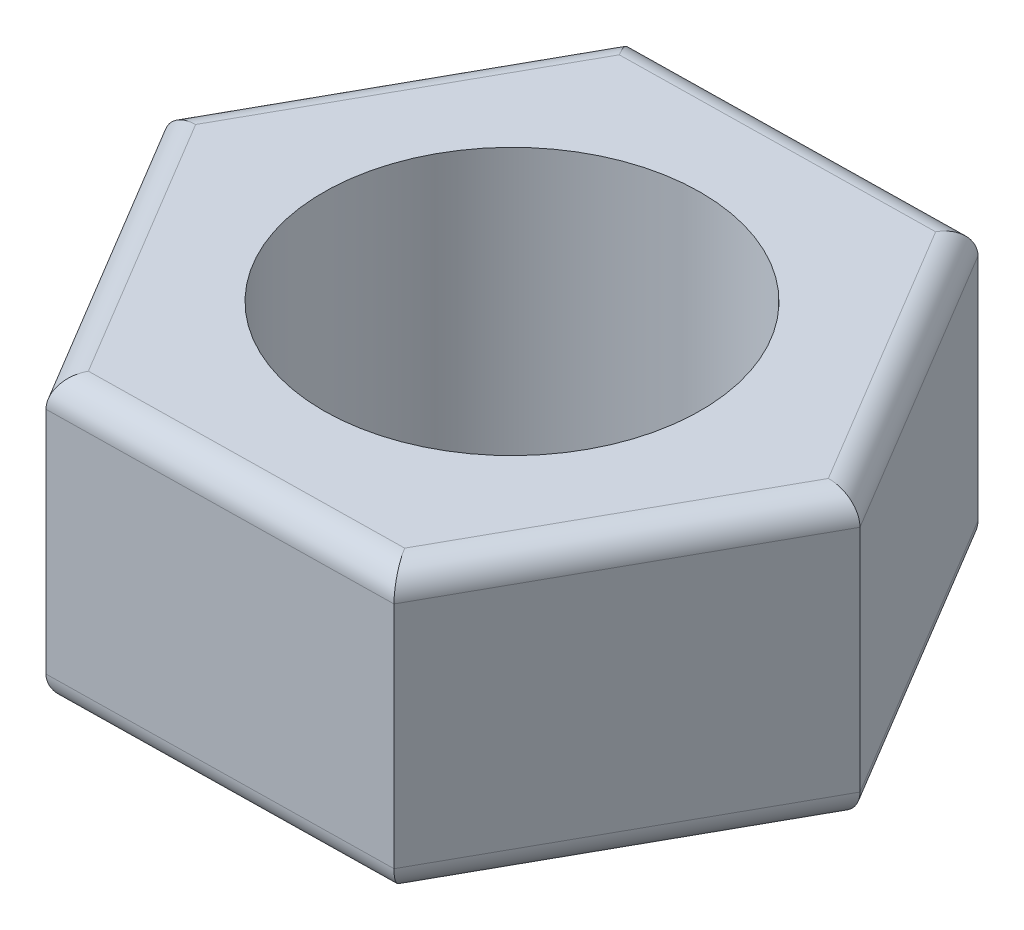
ISO-10303-21;
HEADER;
FILE_DESCRIPTION(('STEP AP214'),'2;1');
FILE_NAME('part.step','',(''),(''),'','','');
FILE_SCHEMA(('AUTOMOTIVE_DESIGN { 1 0 10303 214 1 1 1 1 }'));
ENDSEC;
DATA;
#1=APPLICATION_CONTEXT('core data for automotive mechanical design processes');
#2=APPLICATION_PROTOCOL_DEFINITION('international standard','automotive_design',2000,#1);
#3=PRODUCT_CONTEXT('',#1,'mechanical');
#4=PRODUCT('Part','Part','',(#3));
#5=PRODUCT_RELATED_PRODUCT_CATEGORY('part','',(#4));
#6=PRODUCT_DEFINITION_FORMATION('','',#4);
#7=PRODUCT_DEFINITION_CONTEXT('part definition',#1,'design');
#8=PRODUCT_DEFINITION('design','',#6,#7);
#9=PRODUCT_DEFINITION_SHAPE('','',#8);
#10=(LENGTH_UNIT() NAMED_UNIT(*) SI_UNIT(.MILLI.,.METRE.));
#11=(NAMED_UNIT(*) PLANE_ANGLE_UNIT() SI_UNIT($,.RADIAN.));
#12=(NAMED_UNIT(*) SI_UNIT($,.STERADIAN.) SOLID_ANGLE_UNIT());
#13=UNCERTAINTY_MEASURE_WITH_UNIT(LENGTH_MEASURE(1.E-05),#10,'distance_accuracy_value','');
#14=(GEOMETRIC_REPRESENTATION_CONTEXT(3) GLOBAL_UNCERTAINTY_ASSIGNED_CONTEXT((#13)) GLOBAL_UNIT_ASSIGNED_CONTEXT((#10,
#11,#12)) REPRESENTATION_CONTEXT('',''));
#15=CARTESIAN_POINT('',(0.,0.,0.));
#16=DIRECTION('',(0.,0.,1.));
#17=DIRECTION('',(1.,0.,0.));
#18=AXIS2_PLACEMENT_3D('',#15,#16,#17);
#19=CARTESIAN_POINT('',(6.52368362497381,10.5,10.8983891146619));
#20=DIRECTION('',(0.,1.,0.));
#21=DIRECTION('',(0.,0.,1.));
#22=AXIS2_PLACEMENT_3D('',#19,#20,#21);
#23=PLANE('',#22);
#24=DIRECTION('',(-0.486268542114229,0.,0.873809421412989));
#25=VECTOR('',#24,1.);
#26=CARTESIAN_POINT('',(-11.826314224699,10.5,0.686749730263134));
#27=LINE('',#26,#25);
#28=CARTESIAN_POINT('',(-5.93062147724893,10.5,-9.90762646787449));
#29=VERTEX_POINT('',#28);
#30=CARTESIAN_POINT('',(-11.5455669510109,10.5,0.182255625589913));
#31=VERTEX_POINT('',#30);
#32=EDGE_CURVE('E41',#29,#31,#27,.T.);
#33=ORIENTED_EDGE('',*,*,#32,.T.);
#34=DIRECTION('',(0.513606885952716,0.,0.85802562123864));
#35=VECTOR('',#34,1.);
#36=CARTESIAN_POINT('',(-5.3184143998995,10.5,10.5852634168581));
#37=LINE('',#36,#35);
#38=CARTESIAN_POINT('',(-5.61494547376195,10.5,10.0898820934644));
#39=VERTEX_POINT('',#38);
#40=EDGE_CURVE('E11',#31,#39,#37,.T.);
#41=ORIENTED_EDGE('',*,*,#40,.T.);
#42=DIRECTION('',(0.999875428066945,0.,-0.0157838001743496));
#43=VECTOR('',#42,1.);
#44=CARTESIAN_POINT('',(6.50789982479946,10.5,9.89851368659498));
#45=LINE('',#44,#43);
#46=CARTESIAN_POINT('',(5.93062147724892,10.5,9.90762646787448));
#47=VERTEX_POINT('',#46);
#48=EDGE_CURVE('E157',#39,#47,#45,.T.);
#49=ORIENTED_EDGE('',*,*,#48,.T.);
#50=DIRECTION('',(0.486268542114229,0.,-0.873809421412989));
#51=VECTOR('',#50,1.);
#52=CARTESIAN_POINT('',(11.826314224699,10.5,-0.686749730263147));
#53=LINE('',#52,#51);
#54=CARTESIAN_POINT('',(11.5455669510109,10.5,-0.182255625589923));
#55=VERTEX_POINT('',#54);
#56=EDGE_CURVE('E254',#47,#55,#53,.T.);
#57=ORIENTED_EDGE('',*,*,#56,.T.);
#58=DIRECTION('',(-0.513606885952716,0.,-0.85802562123864));
#59=VECTOR('',#58,1.);
#60=CARTESIAN_POINT('',(5.31841439989949,10.5,-10.5852634168581));
#61=LINE('',#60,#59);
#62=CARTESIAN_POINT('',(5.61494547376194,10.5,-10.0898820934644));
#63=VERTEX_POINT('',#62);
#64=EDGE_CURVE('E256',#55,#63,#61,.T.);
#65=ORIENTED_EDGE('',*,*,#64,.T.);
#66=DIRECTION('',(-0.999875428066945,0.,0.0157838001743493));
#67=VECTOR('',#66,1.);
#68=CARTESIAN_POINT('',(-6.50789982479947,10.5,-9.89851368659499));
#69=LINE('',#68,#67);
#70=EDGE_CURVE('E52',#63,#29,#69,.T.);
#71=ORIENTED_EDGE('',*,*,#70,.T.);
#72=EDGE_LOOP('',(#33,#41,#49,#57,#65,#71));
#73=FACE_BOUND('',#72,.T.);
#74=CARTESIAN_POINT('',(0.,10.5,0.));
#75=DIRECTION('',(0.,1.,0.));
#76=DIRECTION('',(0.,0.,1.));
#77=AXIS2_PLACEMENT_3D('',#74,#75,#76);
#78=CIRCLE('',#77,7.);
#79=CARTESIAN_POINT('',(0.,10.5,-7.));
#80=VERTEX_POINT('',#79);
#81=EDGE_CURVE('E146',#80,#80,#78,.T.);
#82=ORIENTED_EDGE('',*,*,#81,.F.);
#83=EDGE_LOOP('',(#82));
#84=FACE_BOUND('',#83,.T.);
#85=ADVANCED_FACE('F32',(#73,#84),#23,.T.);
#86=CARTESIAN_POINT('',(6.52368362497381,0.,10.8983891146619));
#87=DIRECTION('',(0.,1.,0.));
#88=DIRECTION('',(0.,0.,1.));
#89=AXIS2_PLACEMENT_3D('',#86,#87,#88);
#90=PLANE('',#89);
#91=DIRECTION('',(0.999875428066945,0.,-0.0157838001743496));
#92=VECTOR('',#91,1.);
#93=CARTESIAN_POINT('',(6.50789982479946,0.,9.89851368659498));
#94=LINE('',#93,#92);
#95=CARTESIAN_POINT('',(5.93062147724892,0.,9.90762646787448));
#96=VERTEX_POINT('',#95);
#97=CARTESIAN_POINT('',(-5.61494547376195,0.,10.0898820934644));
#98=VERTEX_POINT('',#97);
#99=EDGE_CURVE('E224',#96,#98,#94,.F.);
#100=ORIENTED_EDGE('',*,*,#99,.T.);
#101=DIRECTION('',(0.513606885952716,0.,0.85802562123864));
#102=VECTOR('',#101,1.);
#103=CARTESIAN_POINT('',(-2.0565725874126,0.,16.0344579741891));
#104=LINE('',#103,#102);
#105=CARTESIAN_POINT('',(-11.5455669510109,0.,0.182255625589914));
#106=VERTEX_POINT('',#105);
#107=EDGE_CURVE('E234',#98,#106,#104,.F.);
#108=ORIENTED_EDGE('',*,*,#107,.T.);
#109=DIRECTION('',(-0.486268542114229,0.,0.873809421412989));
#110=VECTOR('',#109,1.);
#111=CARTESIAN_POINT('',(-11.826314224699,0.,0.686749730263125));
#112=LINE('',#111,#110);
#113=CARTESIAN_POINT('',(-5.93062147724893,0.,-9.90762646787449));
#114=VERTEX_POINT('',#113);
#115=EDGE_CURVE('E232',#106,#114,#112,.F.);
#116=ORIENTED_EDGE('',*,*,#115,.T.);
#117=DIRECTION('',(-0.999875428066945,0.,0.0157838001743493));
#118=VECTOR('',#117,1.);
#119=CARTESIAN_POINT('',(6.19222382131248,0.,-10.0989948747439));
#120=LINE('',#119,#118);
#121=CARTESIAN_POINT('',(5.61494547376194,0.,-10.0898820934644));
#122=VERTEX_POINT('',#121);
#123=EDGE_CURVE('E230',#114,#122,#120,.F.);
#124=ORIENTED_EDGE('',*,*,#123,.T.);
#125=DIRECTION('',(-0.513606885952716,0.,-0.85802562123864));
#126=VECTOR('',#125,1.);
#127=CARTESIAN_POINT('',(15.1039398373602,0.,5.76232025513477));
#128=LINE('',#127,#126);
#129=CARTESIAN_POINT('',(11.5455669510109,0.,-0.182255625589924));
#130=VERTEX_POINT('',#129);
#131=EDGE_CURVE('E228',#122,#130,#128,.F.);
#132=ORIENTED_EDGE('',*,*,#131,.T.);
#133=DIRECTION('',(0.486268542114229,0.,-0.873809421412989));
#134=VECTOR('',#133,1.);
#135=CARTESIAN_POINT('',(5.64987420356082,0.,10.4121205725477));
#136=LINE('',#135,#134);
#137=EDGE_CURVE('E226',#130,#96,#136,.F.);
#138=ORIENTED_EDGE('',*,*,#137,.T.);
#139=EDGE_LOOP('',(#100,#108,#116,#124,#132,#138));
#140=FACE_BOUND('',#139,.T.);
#141=CARTESIAN_POINT('',(0.,0.,0.));
#142=DIRECTION('',(0.,1.,0.));
#143=DIRECTION('',(0.,0.,1.));
#144=AXIS2_PLACEMENT_3D('',#141,#142,#143);
#145=CIRCLE('',#144,7.);
#146=CARTESIAN_POINT('',(0.,0.,-7.));
#147=VERTEX_POINT('',#146);
#148=EDGE_CURVE('E200',#147,#147,#145,.T.);
#149=ORIENTED_EDGE('',*,*,#148,.T.);
#150=EDGE_LOOP('',(#149));
#151=FACE_BOUND('',#150,.T.);
#152=ADVANCED_FACE('F300',(#140,#151),#90,.F.);
#153=CARTESIAN_POINT('',(-6.17644002113814,10.5,11.0988703028108));
#154=DIRECTION('',(-0.0157838001743496,0.,-0.999875428066945));
#155=DIRECTION('',(-0.999875428066945,0.,0.0157838001743496));
#156=AXIS2_PLACEMENT_3D('',#153,#154,#155);
#157=PLANE('',#156);
#158=DIRECTION('',(0.,-1.,0.));
#159=VECTOR('',#158,1.);
#160=CARTESIAN_POINT('',(-6.17644002113814,10.5,11.0988703028108));
#161=LINE('',#160,#159);
#162=CARTESIAN_POINT('',(-6.17644002113814,9.5,11.0988703028108));
#163=VERTEX_POINT('',#162);
#164=CARTESIAN_POINT('',(-6.17644002113814,1.,11.0988703028108));
#165=VERTEX_POINT('',#164);
#166=EDGE_CURVE('E125',#163,#165,#161,.T.);
#167=ORIENTED_EDGE('',*,*,#166,.T.);
#168=DIRECTION('',(0.999875428066945,0.,-0.0157838001743496));
#169=VECTOR('',#168,1.);
#170=CARTESIAN_POINT('',(-6.17644002113814,0.999999999999999,11.0988703028108));
#171=LINE('',#170,#169);
#172=CARTESIAN_POINT('',(6.52368362497381,1.,10.8983891146619));
#173=VERTEX_POINT('',#172);
#174=EDGE_CURVE('E132',#165,#173,#171,.T.);
#175=ORIENTED_EDGE('',*,*,#174,.T.);
#176=DIRECTION('',(0.,-1.,0.));
#177=VECTOR('',#176,1.);
#178=CARTESIAN_POINT('',(6.52368362497381,10.5,10.8983891146619));
#179=LINE('',#178,#177);
#180=CARTESIAN_POINT('',(6.52368362497381,9.5,10.8983891146619));
#181=VERTEX_POINT('',#180);
#182=EDGE_CURVE('E127',#181,#173,#179,.T.);
#183=ORIENTED_EDGE('',*,*,#182,.F.);
#184=DIRECTION('',(0.999875428066945,0.,-0.0157838001743496));
#185=VECTOR('',#184,1.);
#186=CARTESIAN_POINT('',(-6.17644002113815,9.5,11.0988703028108));
#187=LINE('',#186,#185);
#188=EDGE_CURVE('E122',#181,#163,#187,.F.);
#189=ORIENTED_EDGE('',*,*,#188,.T.);
#190=EDGE_LOOP('',(#167,#175,#183,#189));
#191=FACE_BOUND('',#190,.T.);
#192=ADVANCED_FACE('F124',(#191),#157,.F.);
#193=CARTESIAN_POINT('',(6.52368362497381,10.5,10.8983891146619));
#194=DIRECTION('',(-0.873809421412989,0.,-0.486268542114229));
#195=DIRECTION('',(-0.486268542114229,0.,0.873809421412989));
#196=AXIS2_PLACEMENT_3D('',#193,#194,#195);
#197=PLANE('',#196);
#198=ORIENTED_EDGE('',*,*,#182,.T.);
#199=DIRECTION('',(0.486268542114229,0.,-0.873809421412989));
#200=VECTOR('',#199,1.);
#201=CARTESIAN_POINT('',(6.52368362497381,0.999999999999999,10.8983891146619));
#202=LINE('',#201,#200);
#203=CARTESIAN_POINT('',(12.7001236461119,1.,-0.200481188148916));
#204=VERTEX_POINT('',#203);
#205=EDGE_CURVE('E133',#173,#204,#202,.T.);
#206=ORIENTED_EDGE('',*,*,#205,.T.);
#207=DIRECTION('',(0.,-1.,0.));
#208=VECTOR('',#207,1.);
#209=CARTESIAN_POINT('',(12.7001236461119,10.5,-0.200481188148916));
#210=LINE('',#209,#208);
#211=CARTESIAN_POINT('',(12.7001236461119,9.5,-0.200481188148916));
#212=VERTEX_POINT('',#211);
#213=EDGE_CURVE('E219',#212,#204,#210,.T.);
#214=ORIENTED_EDGE('',*,*,#213,.F.);
#215=DIRECTION('',(0.486268542114229,0.,-0.873809421412989));
#216=VECTOR('',#215,1.);
#217=CARTESIAN_POINT('',(6.52368362497381,9.5,10.8983891146619));
#218=LINE('',#217,#216);
#219=EDGE_CURVE('E249',#212,#181,#218,.F.);
#220=ORIENTED_EDGE('',*,*,#219,.T.);
#221=EDGE_LOOP('',(#198,#206,#214,#220));
#222=FACE_BOUND('',#221,.T.);
#223=ADVANCED_FACE('F268',(#222),#197,.F.);
#224=CARTESIAN_POINT('',(12.7001236461119,10.5,-0.200481188148916));
#225=DIRECTION('',(-0.85802562123864,0.,0.513606885952716));
#226=DIRECTION('',(0.513606885952716,0.,0.85802562123864));
#227=AXIS2_PLACEMENT_3D('',#224,#225,#226);
#228=PLANE('',#227);
#229=ORIENTED_EDGE('',*,*,#213,.T.);
#230=DIRECTION('',(-0.513606885952716,0.,-0.85802562123864));
#231=VECTOR('',#230,1.);
#232=CARTESIAN_POINT('',(12.7001236461119,0.999999999999999,-0.200481188148916));
#233=LINE('',#232,#231);
#234=CARTESIAN_POINT('',(6.17644002113813,1.,-11.0988703028108));
#235=VERTEX_POINT('',#234);
#236=EDGE_CURVE('E247',#204,#235,#233,.T.);
#237=ORIENTED_EDGE('',*,*,#236,.T.);
#238=DIRECTION('',(0.,-1.,0.));
#239=VECTOR('',#238,1.);
#240=CARTESIAN_POINT('',(6.17644002113813,10.5,-11.0988703028108));
#241=LINE('',#240,#239);
#242=CARTESIAN_POINT('',(6.17644002113813,9.5,-11.0988703028108));
#243=VERTEX_POINT('',#242);
#244=EDGE_CURVE('E216',#243,#235,#241,.T.);
#245=ORIENTED_EDGE('',*,*,#244,.F.);
#246=DIRECTION('',(-0.513606885952716,0.,-0.85802562123864));
#247=VECTOR('',#246,1.);
#248=CARTESIAN_POINT('',(12.7001236461119,9.5,-0.200481188148916));
#249=LINE('',#248,#247);
#250=EDGE_CURVE('E245',#243,#212,#249,.F.);
#251=ORIENTED_EDGE('',*,*,#250,.T.);
#252=EDGE_LOOP('',(#229,#237,#245,#251));
#253=FACE_BOUND('',#252,.T.);
#254=ADVANCED_FACE('F271',(#253),#228,.F.);
#255=CARTESIAN_POINT('',(6.17644002113813,10.5,-11.0988703028108));
#256=DIRECTION('',(0.0157838001743493,0.,0.999875428066945));
#257=DIRECTION('',(0.999875428066945,0.,-0.0157838001743493));
#258=AXIS2_PLACEMENT_3D('',#255,#256,#257);
#259=PLANE('',#258);
#260=ORIENTED_EDGE('',*,*,#244,.T.);
#261=DIRECTION('',(-0.999875428066945,0.,0.0157838001743493));
#262=VECTOR('',#261,1.);
#263=CARTESIAN_POINT('',(6.17644002113813,0.999999999999999,-11.0988703028108));
#264=LINE('',#263,#262);
#265=CARTESIAN_POINT('',(-6.52368362497382,1.,-10.8983891146619));
#266=VERTEX_POINT('',#265);
#267=EDGE_CURVE('E243',#235,#266,#264,.T.);
#268=ORIENTED_EDGE('',*,*,#267,.T.);
#269=DIRECTION('',(0.,-1.,0.));
#270=VECTOR('',#269,1.);
#271=CARTESIAN_POINT('',(-6.52368362497382,10.5,-10.8983891146619));
#272=LINE('',#271,#270);
#273=CARTESIAN_POINT('',(-6.52368362497382,9.5,-10.8983891146619));
#274=VERTEX_POINT('',#273);
#275=EDGE_CURVE('E213',#274,#266,#272,.T.);
#276=ORIENTED_EDGE('',*,*,#275,.F.);
#277=DIRECTION('',(-0.999875428066945,0.,0.0157838001743493));
#278=VECTOR('',#277,1.);
#279=CARTESIAN_POINT('',(6.17644002113813,9.5,-11.0988703028108));
#280=LINE('',#279,#278);
#281=EDGE_CURVE('E241',#274,#243,#280,.F.);
#282=ORIENTED_EDGE('',*,*,#281,.T.);
#283=EDGE_LOOP('',(#260,#268,#276,#282));
#284=FACE_BOUND('',#283,.T.);
#285=ADVANCED_FACE('F281',(#284),#259,.F.);
#286=CARTESIAN_POINT('',(-6.52368362497382,10.5,-10.8983891146619));
#287=DIRECTION('',(0.873809421412989,0.,0.486268542114229));
#288=DIRECTION('',(0.486268542114229,0.,-0.873809421412989));
#289=AXIS2_PLACEMENT_3D('',#286,#287,#288);
#290=PLANE('',#289);
#291=ORIENTED_EDGE('',*,*,#275,.T.);
#292=DIRECTION('',(-0.486268542114229,0.,0.873809421412989));
#293=VECTOR('',#292,1.);
#294=CARTESIAN_POINT('',(-6.52368362497382,0.999999999999999,-10.8983891146619));
#295=LINE('',#294,#293);
#296=CARTESIAN_POINT('',(-12.7001236461119,1.,0.200481188148907));
#297=VERTEX_POINT('',#296);
#298=EDGE_CURVE('E239',#266,#297,#295,.T.);
#299=ORIENTED_EDGE('',*,*,#298,.T.);
#300=DIRECTION('',(0.,-1.,0.));
#301=VECTOR('',#300,1.);
#302=CARTESIAN_POINT('',(-12.7001236461119,10.5,0.200481188148907));
#303=LINE('',#302,#301);
#304=CARTESIAN_POINT('',(-12.7001236461119,9.5,0.200481188148907));
#305=VERTEX_POINT('',#304);
#306=EDGE_CURVE('E145',#305,#297,#303,.T.);
#307=ORIENTED_EDGE('',*,*,#306,.F.);
#308=DIRECTION('',(-0.486268542114229,0.,0.873809421412989));
#309=VECTOR('',#308,1.);
#310=CARTESIAN_POINT('',(-6.52368362497382,9.5,-10.8983891146619));
#311=LINE('',#310,#309);
#312=EDGE_CURVE('E237',#305,#274,#311,.F.);
#313=ORIENTED_EDGE('',*,*,#312,.T.);
#314=EDGE_LOOP('',(#291,#299,#307,#313));
#315=FACE_BOUND('',#314,.T.);
#316=ADVANCED_FACE('F283',(#315),#290,.F.);
#317=CARTESIAN_POINT('',(-12.7001236461119,10.5,0.200481188148907));
#318=DIRECTION('',(0.85802562123864,0.,-0.513606885952716));
#319=DIRECTION('',(-0.513606885952716,0.,-0.85802562123864));
#320=AXIS2_PLACEMENT_3D('',#317,#318,#319);
#321=PLANE('',#320);
#322=ORIENTED_EDGE('',*,*,#306,.T.);
#323=DIRECTION('',(0.513606885952716,0.,0.85802562123864));
#324=VECTOR('',#323,1.);
#325=CARTESIAN_POINT('',(-12.7001236461119,0.999999999999999,0.200481188148907));
#326=LINE('',#325,#324);
#327=EDGE_CURVE('E144',#297,#165,#326,.T.);
#328=ORIENTED_EDGE('',*,*,#327,.T.);
#329=ORIENTED_EDGE('',*,*,#166,.F.);
#330=DIRECTION('',(0.513606885952716,0.,0.85802562123864));
#331=VECTOR('',#330,1.);
#332=CARTESIAN_POINT('',(-12.7001236461119,9.5,0.200481188148907));
#333=LINE('',#332,#331);
#334=EDGE_CURVE('E141',#163,#305,#333,.F.);
#335=ORIENTED_EDGE('',*,*,#334,.T.);
#336=EDGE_LOOP('',(#322,#328,#329,#335));
#337=FACE_BOUND('',#336,.T.);
#338=ADVANCED_FACE('F140',(#337),#321,.F.);
#339=CARTESIAN_POINT('',(0.,10.5,0.));
#340=DIRECTION('',(0.,-1.,0.));
#341=DIRECTION('',(0.,0.,-1.));
#342=AXIS2_PLACEMENT_3D('',#339,#340,#341);
#343=CYLINDRICAL_SURFACE('',#342,7.);
#344=CARTESIAN_POINT('',(0.,10.5,-7.));
#345=CARTESIAN_POINT('',(0.,10.390625,-7.));
#346=CARTESIAN_POINT('',(0.,10.28125,-7.));
#347=CARTESIAN_POINT('',(0.,10.0625,-7.));
#348=CARTESIAN_POINT('',(0.,9.953125,-7.));
#349=CARTESIAN_POINT('',(0.,9.734375,-7.));
#350=CARTESIAN_POINT('',(0.,9.625,-7.));
#351=CARTESIAN_POINT('',(0.,9.40625,-7.));
#352=CARTESIAN_POINT('',(0.,9.296875,-7.));
#353=CARTESIAN_POINT('',(0.,9.078125,-7.));
#354=CARTESIAN_POINT('',(0.,8.96875,-7.));
#355=CARTESIAN_POINT('',(0.,8.75,-7.));
#356=CARTESIAN_POINT('',(0.,8.640625,-7.));
#357=CARTESIAN_POINT('',(0.,8.421875,-7.));
#358=CARTESIAN_POINT('',(0.,8.3125,-7.));
#359=CARTESIAN_POINT('',(0.,8.09375,-7.));
#360=CARTESIAN_POINT('',(0.,7.984375,-7.));
#361=CARTESIAN_POINT('',(0.,7.765625,-7.));
#362=CARTESIAN_POINT('',(0.,7.65625,-7.));
#363=CARTESIAN_POINT('',(0.,7.4375,-7.));
#364=CARTESIAN_POINT('',(0.,7.328125,-7.));
#365=CARTESIAN_POINT('',(0.,7.109375,-7.));
#366=CARTESIAN_POINT('',(0.,7.,-7.));
#367=CARTESIAN_POINT('',(0.,6.78125,-7.));
#368=CARTESIAN_POINT('',(0.,6.671875,-7.));
#369=CARTESIAN_POINT('',(0.,6.453125,-7.));
#370=CARTESIAN_POINT('',(0.,6.34375,-7.));
#371=CARTESIAN_POINT('',(0.,6.125,-7.));
#372=CARTESIAN_POINT('',(0.,6.015625,-7.));
#373=CARTESIAN_POINT('',(0.,5.796875,-7.));
#374=CARTESIAN_POINT('',(0.,5.6875,-7.));
#375=CARTESIAN_POINT('',(0.,5.46875,-7.));
#376=CARTESIAN_POINT('',(0.,5.359375,-7.));
#377=CARTESIAN_POINT('',(0.,5.140625,-7.));
#378=CARTESIAN_POINT('',(0.,5.03125,-7.));
#379=CARTESIAN_POINT('',(0.,4.8125,-7.));
#380=CARTESIAN_POINT('',(0.,4.703125,-7.));
#381=CARTESIAN_POINT('',(0.,4.484375,-7.));
#382=CARTESIAN_POINT('',(0.,4.375,-7.));
#383=CARTESIAN_POINT('',(0.,4.15625,-7.));
#384=CARTESIAN_POINT('',(0.,4.046875,-7.));
#385=CARTESIAN_POINT('',(0.,3.828125,-7.));
#386=CARTESIAN_POINT('',(0.,3.71875,-7.));
#387=CARTESIAN_POINT('',(0.,3.5,-7.));
#388=CARTESIAN_POINT('',(0.,3.390625,-7.));
#389=CARTESIAN_POINT('',(0.,3.171875,-7.));
#390=CARTESIAN_POINT('',(0.,3.0625,-7.));
#391=CARTESIAN_POINT('',(0.,2.84375,-7.));
#392=CARTESIAN_POINT('',(0.,2.734375,-7.));
#393=CARTESIAN_POINT('',(0.,2.515625,-7.));
#394=CARTESIAN_POINT('',(0.,2.40625,-7.));
#395=CARTESIAN_POINT('',(0.,2.1875,-7.));
#396=CARTESIAN_POINT('',(0.,2.078125,-7.));
#397=CARTESIAN_POINT('',(0.,1.859375,-7.));
#398=CARTESIAN_POINT('',(0.,1.75,-7.));
#399=CARTESIAN_POINT('',(0.,1.53125,-7.));
#400=CARTESIAN_POINT('',(0.,1.421875,-7.));
#401=CARTESIAN_POINT('',(0.,1.203125,-7.));
#402=CARTESIAN_POINT('',(0.,1.09375,-7.));
#403=CARTESIAN_POINT('',(0.,0.875000000000001,-7.));
#404=CARTESIAN_POINT('',(0.,0.765625000000001,-7.));
#405=CARTESIAN_POINT('',(0.,0.546875,-7.));
#406=CARTESIAN_POINT('',(0.,0.4375,-7.));
#407=CARTESIAN_POINT('',(0.,0.21875,-7.));
#408=CARTESIAN_POINT('',(0.,0.109375,-7.));
#409=CARTESIAN_POINT('',(0.,0.,-7.));
#410=B_SPLINE_CURVE_WITH_KNOTS('',3,(#344,#345,#346,#347,#348,#349,#350,#351,#352,#353,#354,
#355,#356,#357,#358,#359,#360,#361,#362,#363,#364,#365,#366,#367,#368,#369,#370,#371,#372,#373,
#374,#375,#376,#377,#378,#379,#380,#381,#382,#383,#384,#385,#386,#387,#388,#389,#390,#391,#392,
#393,#394,#395,#396,#397,#398,#399,#400,#401,#402,#403,#404,#405,#406,#407,#408,#409),
.UNSPECIFIED.,.F.,.F.,(4,2,2,2,2,2,2,2,2,2,2,2,2,2,2,2,2,2,2,2,2,2,2,2,2,2,2,2,2,2,2,2,4),(0.,
0.328125,0.656250000000001,0.984375000000001,1.3125,1.640625,1.96875,2.296875,2.625,2.953125,
3.28125,3.609375,3.9375,4.265625,4.59375,4.921875,5.25,5.578125,5.90625,6.234375,6.5625,
6.890625,7.21875,7.546875,7.875,8.203125,8.53125,8.859375,9.1875,9.515625,9.84375,10.171875,
10.5),.UNSPECIFIED.);
#411=EDGE_CURVE('BSEAM308',#80,#147,#410,.T.);
#412=ORIENTED_EDGE('',*,*,#81,.T.);
#413=ORIENTED_EDGE('',*,*,#148,.F.);
#414=ORIENTED_EDGE('',*,*,#411,.T.);
#415=ORIENTED_EDGE('',*,*,#411,.F.);
#416=EDGE_LOOP('',(#412,#414,#413,#415));
#417=FACE_BOUND('',#416,.T.);
#418=ADVANCED_FACE('F308',(#417),#343,.F.);
#419=CARTESIAN_POINT('',(11.8420980248733,0.999999999999999,0.3131256978038));
#420=DIRECTION('',(-0.513606885952716,0.,-0.85802562123864));
#421=DIRECTION('',(-0.85802562123864,0.,0.513606885952716));
#422=AXIS2_PLACEMENT_3D('',#419,#420,#421);
#423=CYLINDRICAL_SURFACE('',#422,1.);
#424=CARTESIAN_POINT('',(11.5455669510109,0.999999999999999,-0.182255625589924));
#425=DIRECTION('',(-0.0157838001743492,0.,-0.999875428066945));
#426=DIRECTION('',(0.999875428066945,0.,-0.0157838001743493));
#427=AXIS2_PLACEMENT_3D('',#424,#425,#426);
#428=ELLIPSE('',#427,1.15470053837925,1.);
#429=EDGE_CURVE('E193',#130,#204,#428,.F.);
#430=ORIENTED_EDGE('',*,*,#429,.F.);
#431=ORIENTED_EDGE('',*,*,#131,.F.);
#432=CARTESIAN_POINT('',(5.61494547376194,0.999999999999999,-10.0898820934644));
#433=DIRECTION('',(-0.873809421412989,0.,-0.486268542114229));
#434=DIRECTION('',(0.486268542114229,0.,-0.873809421412989));
#435=AXIS2_PLACEMENT_3D('',#432,#433,#434);
#436=ELLIPSE('',#435,1.15470053837925,1.);
#437=EDGE_CURVE('E162',#235,#122,#436,.T.);
#438=ORIENTED_EDGE('',*,*,#437,.F.);
#439=ORIENTED_EDGE('',*,*,#236,.F.);
#440=EDGE_LOOP('',(#430,#431,#438,#439));
#441=FACE_BOUND('',#440,.T.);
#442=ADVANCED_FACE('F274',(#441),#423,.T.);
#443=CARTESIAN_POINT('',(6.19222382131248,0.999999999999999,-10.0989948747439));
#444=DIRECTION('',(-0.999875428066945,0.,0.0157838001743493));
#445=DIRECTION('',(0.0157838001743493,0.,0.999875428066945));
#446=AXIS2_PLACEMENT_3D('',#443,#444,#445);
#447=CYLINDRICAL_SURFACE('',#446,1.);
#448=ORIENTED_EDGE('',*,*,#437,.T.);
#449=ORIENTED_EDGE('',*,*,#123,.F.);
#450=CARTESIAN_POINT('',(-5.93062147724893,0.999999999999999,-9.90762646787449));
#451=DIRECTION('',(-0.85802562123864,0.,0.513606885952716));
#452=DIRECTION('',(-0.513606885952716,0.,-0.85802562123864));
#453=AXIS2_PLACEMENT_3D('',#450,#451,#452);
#454=ELLIPSE('',#453,1.15470053837925,1.);
#455=EDGE_CURVE('E191',#266,#114,#454,.T.);
#456=ORIENTED_EDGE('',*,*,#455,.F.);
#457=ORIENTED_EDGE('',*,*,#267,.F.);
#458=EDGE_LOOP('',(#448,#449,#456,#457));
#459=FACE_BOUND('',#458,.T.);
#460=ADVANCED_FACE('F277',(#459),#447,.T.);
#461=CARTESIAN_POINT('',(5.64987420356082,0.999999999999999,10.4121205725477));
#462=DIRECTION('',(0.486268542114229,0.,-0.873809421412989));
#463=DIRECTION('',(-0.873809421412989,0.,-0.486268542114229));
#464=AXIS2_PLACEMENT_3D('',#461,#462,#463);
#465=CYLINDRICAL_SURFACE('',#464,1.);
#466=ORIENTED_EDGE('',*,*,#429,.T.);
#467=ORIENTED_EDGE('',*,*,#205,.F.);
#468=CARTESIAN_POINT('',(5.93062147724892,0.999999999999999,9.90762646787448));
#469=DIRECTION('',(0.85802562123864,0.,-0.513606885952716));
#470=DIRECTION('',(0.513606885952716,0.,0.85802562123864));
#471=AXIS2_PLACEMENT_3D('',#468,#469,#470);
#472=ELLIPSE('',#471,1.15470053837925,1.);
#473=EDGE_CURVE('E185',#96,#173,#472,.F.);
#474=ORIENTED_EDGE('',*,*,#473,.F.);
#475=ORIENTED_EDGE('',*,*,#137,.F.);
#476=EDGE_LOOP('',(#466,#467,#474,#475));
#477=FACE_BOUND('',#476,.T.);
#478=ADVANCED_FACE('F362',(#477),#465,.T.);
#479=CARTESIAN_POINT('',(-5.64987420356083,0.999999999999999,-10.4121205725477));
#480=DIRECTION('',(-0.486268542114229,0.,0.873809421412989));
#481=DIRECTION('',(0.873809421412989,0.,0.486268542114229));
#482=AXIS2_PLACEMENT_3D('',#479,#480,#481);
#483=CYLINDRICAL_SURFACE('',#482,1.);
#484=ORIENTED_EDGE('',*,*,#455,.T.);
#485=ORIENTED_EDGE('',*,*,#115,.F.);
#486=CARTESIAN_POINT('',(-11.5455669510109,0.999999999999999,0.182255625589913));
#487=DIRECTION('',(0.015783800174349,0.,0.999875428066945));
#488=DIRECTION('',(-0.999875428066945,0.,0.015783800174349));
#489=AXIS2_PLACEMENT_3D('',#486,#487,#488);
#490=ELLIPSE('',#489,1.15470053837925,1.);
#491=EDGE_CURVE('E179',#297,#106,#490,.T.);
#492=ORIENTED_EDGE('',*,*,#491,.F.);
#493=ORIENTED_EDGE('',*,*,#298,.F.);
#494=EDGE_LOOP('',(#484,#485,#492,#493));
#495=FACE_BOUND('',#494,.T.);
#496=ADVANCED_FACE('F287',(#495),#483,.T.);
#497=CARTESIAN_POINT('',(-6.19222382131249,0.999999999999999,10.0989948747439));
#498=DIRECTION('',(0.999875428066945,0.,-0.0157838001743496));
#499=DIRECTION('',(-0.0157838001743496,0.,-0.999875428066945));
#500=AXIS2_PLACEMENT_3D('',#497,#498,#499);
#501=CYLINDRICAL_SURFACE('',#500,1.);
#502=ORIENTED_EDGE('',*,*,#473,.T.);
#503=ORIENTED_EDGE('',*,*,#174,.F.);
#504=CARTESIAN_POINT('',(-5.61494547376195,0.999999999999999,10.0898820934644));
#505=DIRECTION('',(0.873809421412989,0.,0.486268542114229));
#506=DIRECTION('',(0.486268542114229,0.,-0.873809421412989));
#507=AXIS2_PLACEMENT_3D('',#504,#505,#506);
#508=ELLIPSE('',#507,1.15470053837925,1.);
#509=EDGE_CURVE('E175',#98,#165,#508,.F.);
#510=ORIENTED_EDGE('',*,*,#509,.F.);
#511=ORIENTED_EDGE('',*,*,#99,.F.);
#512=EDGE_LOOP('',(#502,#503,#510,#511));
#513=FACE_BOUND('',#512,.T.);
#514=ADVANCED_FACE('F290',(#513),#501,.T.);
#515=CARTESIAN_POINT('',(-11.8420980248733,0.999999999999999,-0.313125697803809));
#516=DIRECTION('',(0.513606885952716,0.,0.85802562123864));
#517=DIRECTION('',(0.85802562123864,0.,-0.513606885952716));
#518=AXIS2_PLACEMENT_3D('',#515,#516,#517);
#519=CYLINDRICAL_SURFACE('',#518,1.);
#520=ORIENTED_EDGE('',*,*,#491,.T.);
#521=ORIENTED_EDGE('',*,*,#107,.F.);
#522=ORIENTED_EDGE('',*,*,#509,.T.);
#523=ORIENTED_EDGE('',*,*,#327,.F.);
#524=EDGE_LOOP('',(#520,#521,#522,#523));
#525=FACE_BOUND('',#524,.T.);
#526=ADVANCED_FACE('F288',(#525),#519,.T.);
#527=CARTESIAN_POINT('',(15.1039398373602,9.5,5.76232025513477));
#528=DIRECTION('',(0.513606885952716,0.,0.85802562123864));
#529=DIRECTION('',(0.85802562123864,0.,-0.513606885952716));
#530=AXIS2_PLACEMENT_3D('',#527,#528,#529);
#531=CYLINDRICAL_SURFACE('',#530,1.);
#532=CARTESIAN_POINT('',(11.5455669510109,9.5,-0.182255625589924));
#533=DIRECTION('',(0.0157838001743492,0.,0.999875428066945));
#534=DIRECTION('',(-0.999875428066945,0.,0.0157838001743493));
#535=AXIS2_PLACEMENT_3D('',#532,#533,#534);
#536=ELLIPSE('',#535,1.15470053837925,1.);
#537=EDGE_CURVE('E168',#212,#55,#536,.T.);
#538=ORIENTED_EDGE('',*,*,#537,.F.);
#539=ORIENTED_EDGE('',*,*,#250,.F.);
#540=CARTESIAN_POINT('',(5.61494547376194,9.5,-10.0898820934644));
#541=DIRECTION('',(0.873809421412989,0.,0.486268542114229));
#542=DIRECTION('',(-0.486268542114229,0.,0.873809421412989));
#543=AXIS2_PLACEMENT_3D('',#540,#541,#542);
#544=ELLIPSE('',#543,1.15470053837925,1.);
#545=EDGE_CURVE('E36',#63,#243,#544,.F.);
#546=ORIENTED_EDGE('',*,*,#545,.F.);
#547=ORIENTED_EDGE('',*,*,#64,.F.);
#548=EDGE_LOOP('',(#538,#539,#546,#547));
#549=FACE_BOUND('',#548,.T.);
#550=ADVANCED_FACE('F34',(#549),#531,.T.);
#551=CARTESIAN_POINT('',(6.19222382131248,9.5,-10.0989948747439));
#552=DIRECTION('',(0.999875428066945,0.,-0.0157838001743493));
#553=DIRECTION('',(-0.0157838001743493,0.,-0.999875428066945));
#554=AXIS2_PLACEMENT_3D('',#551,#552,#553);
#555=CYLINDRICAL_SURFACE('',#554,1.);
#556=ORIENTED_EDGE('',*,*,#545,.T.);
#557=ORIENTED_EDGE('',*,*,#281,.F.);
#558=CARTESIAN_POINT('',(-5.93062147724893,9.5,-9.90762646787448));
#559=DIRECTION('',(0.85802562123864,0.,-0.513606885952716));
#560=DIRECTION('',(0.513606885952716,0.,0.85802562123864));
#561=AXIS2_PLACEMENT_3D('',#558,#559,#560);
#562=ELLIPSE('',#561,1.15470053837925,1.);
#563=EDGE_CURVE('E166',#29,#274,#562,.F.);
#564=ORIENTED_EDGE('',*,*,#563,.F.);
#565=ORIENTED_EDGE('',*,*,#70,.F.);
#566=EDGE_LOOP('',(#556,#557,#564,#565));
#567=FACE_BOUND('',#566,.T.);
#568=ADVANCED_FACE('F262',(#567),#555,.T.);
#569=CARTESIAN_POINT('',(5.64987420356082,9.5,10.4121205725477));
#570=DIRECTION('',(-0.486268542114229,0.,0.873809421412989));
#571=DIRECTION('',(0.873809421412989,0.,0.486268542114229));
#572=AXIS2_PLACEMENT_3D('',#569,#570,#571);
#573=CYLINDRICAL_SURFACE('',#572,1.);
#574=ORIENTED_EDGE('',*,*,#537,.T.);
#575=ORIENTED_EDGE('',*,*,#56,.F.);
#576=CARTESIAN_POINT('',(5.93062147724892,9.5,9.90762646787448));
#577=DIRECTION('',(-0.85802562123864,0.,0.513606885952716));
#578=DIRECTION('',(-0.513606885952716,0.,-0.85802562123864));
#579=AXIS2_PLACEMENT_3D('',#576,#577,#578);
#580=ELLIPSE('',#579,1.15470053837925,1.);
#581=EDGE_CURVE('E159',#181,#47,#580,.T.);
#582=ORIENTED_EDGE('',*,*,#581,.F.);
#583=ORIENTED_EDGE('',*,*,#219,.F.);
#584=EDGE_LOOP('',(#574,#575,#582,#583));
#585=FACE_BOUND('',#584,.T.);
#586=ADVANCED_FACE('F265',(#585),#573,.T.);
#587=CARTESIAN_POINT('',(-11.826314224699,9.5,0.686749730263125));
#588=DIRECTION('',(0.486268542114229,0.,-0.873809421412989));
#589=DIRECTION('',(-0.873809421412989,0.,-0.486268542114229));
#590=AXIS2_PLACEMENT_3D('',#587,#588,#589);
#591=CYLINDRICAL_SURFACE('',#590,1.);
#592=ORIENTED_EDGE('',*,*,#563,.T.);
#593=ORIENTED_EDGE('',*,*,#312,.F.);
#594=CARTESIAN_POINT('',(-11.5455669510109,9.5,0.182255625589913));
#595=DIRECTION('',(-0.015783800174349,0.,-0.999875428066945));
#596=DIRECTION('',(0.999875428066945,0.,-0.015783800174349));
#597=AXIS2_PLACEMENT_3D('',#594,#595,#596);
#598=ELLIPSE('',#597,1.15470053837925,1.);
#599=EDGE_CURVE('E153',#31,#305,#598,.F.);
#600=ORIENTED_EDGE('',*,*,#599,.F.);
#601=ORIENTED_EDGE('',*,*,#32,.F.);
#602=EDGE_LOOP('',(#592,#593,#600,#601));
#603=FACE_BOUND('',#602,.T.);
#604=ADVANCED_FACE('F264',(#603),#591,.T.);
#605=CARTESIAN_POINT('',(6.50789982479946,9.5,9.89851368659498));
#606=DIRECTION('',(-0.999875428066945,0.,0.0157838001743496));
#607=DIRECTION('',(0.0157838001743496,0.,0.999875428066945));
#608=AXIS2_PLACEMENT_3D('',#605,#606,#607);
#609=CYLINDRICAL_SURFACE('',#608,1.);
#610=ORIENTED_EDGE('',*,*,#581,.T.);
#611=ORIENTED_EDGE('',*,*,#48,.F.);
#612=CARTESIAN_POINT('',(-5.61494547376195,9.5,10.0898820934644));
#613=DIRECTION('',(-0.873809421412989,0.,-0.486268542114229));
#614=DIRECTION('',(-0.486268542114229,0.,0.873809421412989));
#615=AXIS2_PLACEMENT_3D('',#612,#613,#614);
#616=ELLIPSE('',#615,1.15470053837925,1.);
#617=EDGE_CURVE('E151',#163,#39,#616,.T.);
#618=ORIENTED_EDGE('',*,*,#617,.F.);
#619=ORIENTED_EDGE('',*,*,#188,.F.);
#620=EDGE_LOOP('',(#610,#611,#618,#619));
#621=FACE_BOUND('',#620,.T.);
#622=ADVANCED_FACE('F156',(#621),#609,.T.);
#623=CARTESIAN_POINT('',(-2.0565725874126,9.5,16.0344579741891));
#624=DIRECTION('',(-0.513606885952716,0.,-0.85802562123864));
#625=DIRECTION('',(-0.85802562123864,0.,0.513606885952716));
#626=AXIS2_PLACEMENT_3D('',#623,#624,#625);
#627=CYLINDRICAL_SURFACE('',#626,1.);
#628=ORIENTED_EDGE('',*,*,#599,.T.);
#629=ORIENTED_EDGE('',*,*,#334,.F.);
#630=ORIENTED_EDGE('',*,*,#617,.T.);
#631=ORIENTED_EDGE('',*,*,#40,.F.);
#632=EDGE_LOOP('',(#628,#629,#630,#631));
#633=FACE_BOUND('',#632,.T.);
#634=ADVANCED_FACE('F149',(#633),#627,.T.);
#635=CLOSED_SHELL('',(#85,#152,#192,#223,#254,#285,#316,#338,#418,#442,#460,#478,#496,#514,#526,
#550,#568,#586,#604,#622,#634));
#636=MANIFOLD_SOLID_BREP('B2',#635);
#637=ADVANCED_BREP_SHAPE_REPRESENTATION('',(#18,#636),#14);
#638=SHAPE_DEFINITION_REPRESENTATION(#9,#637);
ENDSEC;
END-ISO-10303-21;
